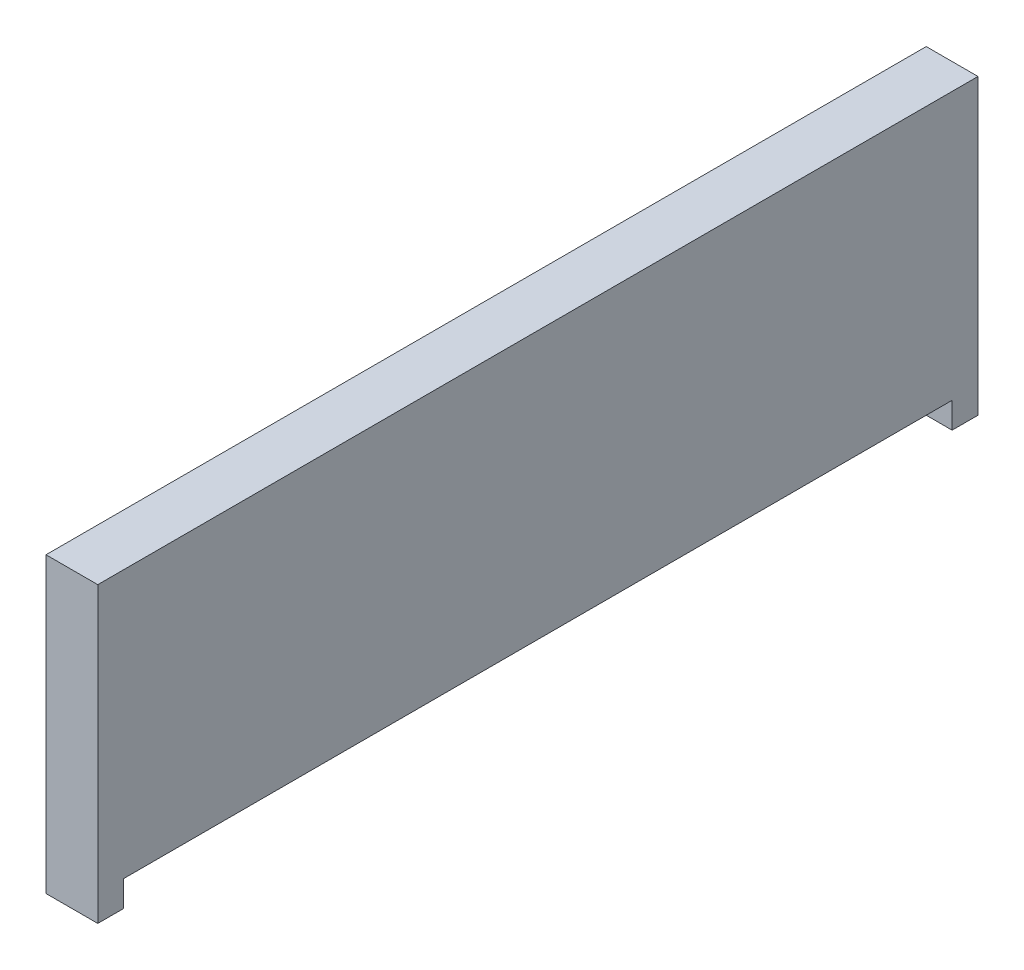
ISO-10303-21;
HEADER;
FILE_DESCRIPTION(('STEP AP214'),'2;1');
FILE_NAME('part.step','',(''),(''),'','','');
FILE_SCHEMA(('AUTOMOTIVE_DESIGN { 1 0 10303 214 1 1 1 1 }'));
ENDSEC;
DATA;
#1=APPLICATION_CONTEXT('core data for automotive mechanical design processes');
#2=APPLICATION_PROTOCOL_DEFINITION('international standard','automotive_design',2000,#1);
#3=PRODUCT_CONTEXT('',#1,'mechanical');
#4=PRODUCT('Part','Part','',(#3));
#5=PRODUCT_RELATED_PRODUCT_CATEGORY('part','',(#4));
#6=PRODUCT_DEFINITION_FORMATION('','',#4);
#7=PRODUCT_DEFINITION_CONTEXT('part definition',#1,'design');
#8=PRODUCT_DEFINITION('design','',#6,#7);
#9=PRODUCT_DEFINITION_SHAPE('','',#8);
#10=(LENGTH_UNIT() NAMED_UNIT(*) SI_UNIT(.MILLI.,.METRE.));
#11=(NAMED_UNIT(*) PLANE_ANGLE_UNIT() SI_UNIT($,.RADIAN.));
#12=(NAMED_UNIT(*) SI_UNIT($,.STERADIAN.) SOLID_ANGLE_UNIT());
#13=UNCERTAINTY_MEASURE_WITH_UNIT(LENGTH_MEASURE(1.E-05),#10,'distance_accuracy_value','');
#14=(GEOMETRIC_REPRESENTATION_CONTEXT(3) GLOBAL_UNCERTAINTY_ASSIGNED_CONTEXT((#13)) GLOBAL_UNIT_ASSIGNED_CONTEXT((#10,
#11,#12)) REPRESENTATION_CONTEXT('',''));
#15=CARTESIAN_POINT('',(0.,0.,0.));
#16=DIRECTION('',(0.,0.,1.));
#17=DIRECTION('',(1.,0.,0.));
#18=AXIS2_PLACEMENT_3D('',#15,#16,#17);
#19=CARTESIAN_POINT('',(15.,0.,510.));
#20=DIRECTION('',(-1.,0.,0.));
#21=DIRECTION('',(0.,0.,1.));
#22=AXIS2_PLACEMENT_3D('',#19,#20,#21);
#23=PLANE('',#22);
#24=DIRECTION('',(0.,0.,-1.));
#25=VECTOR('',#24,1.);
#26=CARTESIAN_POINT('',(15.,15.,510.));
#27=LINE('',#26,#25);
#28=CARTESIAN_POINT('',(15.,15.,495.));
#29=VERTEX_POINT('',#28);
#30=CARTESIAN_POINT('',(15.,15.,15.));
#31=VERTEX_POINT('',#30);
#32=EDGE_CURVE('E57',#29,#31,#27,.T.);
#33=ORIENTED_EDGE('',*,*,#32,.F.);
#34=DIRECTION('',(0.,1.,0.));
#35=VECTOR('',#34,1.);
#36=CARTESIAN_POINT('',(15.,15.,495.));
#37=LINE('',#36,#35);
#38=CARTESIAN_POINT('',(15.,0.,495.));
#39=VERTEX_POINT('',#38);
#40=EDGE_CURVE('E132',#39,#29,#37,.T.);
#41=ORIENTED_EDGE('',*,*,#40,.F.);
#42=DIRECTION('',(0.,0.,-1.));
#43=VECTOR('',#42,1.);
#44=CARTESIAN_POINT('',(15.,0.,510.));
#45=LINE('',#44,#43);
#46=CARTESIAN_POINT('',(15.,0.,15.));
#47=VERTEX_POINT('',#46);
#48=EDGE_CURVE('E43',#39,#47,#45,.T.);
#49=ORIENTED_EDGE('',*,*,#48,.T.);
#50=DIRECTION('',(0.,1.,0.));
#51=VECTOR('',#50,1.);
#52=CARTESIAN_POINT('',(15.,15.,15.));
#53=LINE('',#52,#51);
#54=EDGE_CURVE('E138',#47,#31,#53,.T.);
#55=ORIENTED_EDGE('',*,*,#54,.T.);
#56=EDGE_LOOP('',(#33,#41,#49,#55));
#57=FACE_BOUND('',#56,.T.);
#58=ADVANCED_FACE('F35',(#57),#23,.F.);
#59=CARTESIAN_POINT('',(15.,15.,510.));
#60=DIRECTION('',(0.,1.,0.));
#61=DIRECTION('',(0.,0.,1.));
#62=AXIS2_PLACEMENT_3D('',#59,#60,#61);
#63=PLANE('',#62);
#64=DIRECTION('',(0.,0.,-1.));
#65=VECTOR('',#64,1.);
#66=CARTESIAN_POINT('',(30.,15.,510.));
#67=LINE('',#66,#65);
#68=CARTESIAN_POINT('',(30.,15.,495.));
#69=VERTEX_POINT('',#68);
#70=CARTESIAN_POINT('',(30.,15.,15.));
#71=VERTEX_POINT('',#70);
#72=EDGE_CURVE('E160',#69,#71,#67,.T.);
#73=ORIENTED_EDGE('',*,*,#72,.F.);
#74=DIRECTION('',(1.,0.,0.));
#75=VECTOR('',#74,1.);
#76=CARTESIAN_POINT('',(30.,15.,495.));
#77=LINE('',#76,#75);
#78=EDGE_CURVE('E126',#29,#69,#77,.T.);
#79=ORIENTED_EDGE('',*,*,#78,.F.);
#80=ORIENTED_EDGE('',*,*,#32,.T.);
#81=DIRECTION('',(1.,0.,0.));
#82=VECTOR('',#81,1.);
#83=CARTESIAN_POINT('',(30.,15.,15.));
#84=LINE('',#83,#82);
#85=EDGE_CURVE('E140',#31,#71,#84,.T.);
#86=ORIENTED_EDGE('',*,*,#85,.T.);
#87=EDGE_LOOP('',(#73,#79,#80,#86));
#88=FACE_BOUND('',#87,.T.);
#89=ADVANCED_FACE('F166',(#88),#63,.F.);
#90=CARTESIAN_POINT('',(0.,170.,510.));
#91=DIRECTION('',(1.,0.,0.));
#92=DIRECTION('',(0.,1.,0.));
#93=AXIS2_PLACEMENT_3D('',#90,#91,#92);
#94=PLANE('',#93);
#95=DIRECTION('',(0.,-1.,0.));
#96=VECTOR('',#95,1.);
#97=CARTESIAN_POINT('',(0.,170.,0.));
#98=LINE('',#97,#96);
#99=CARTESIAN_POINT('',(0.,170.,0.));
#100=VERTEX_POINT('',#99);
#101=CARTESIAN_POINT('',(0.,0.,0.));
#102=VERTEX_POINT('',#101);
#103=EDGE_CURVE('E145',#100,#102,#98,.T.);
#104=ORIENTED_EDGE('',*,*,#103,.T.);
#105=DIRECTION('',(0.,0.,-1.));
#106=VECTOR('',#105,1.);
#107=CARTESIAN_POINT('',(0.,0.,510.));
#108=LINE('',#107,#106);
#109=CARTESIAN_POINT('',(0.,0.,510.));
#110=VERTEX_POINT('',#109);
#111=EDGE_CURVE('E11',#110,#102,#108,.T.);
#112=ORIENTED_EDGE('',*,*,#111,.F.);
#113=DIRECTION('',(0.,-1.,0.));
#114=VECTOR('',#113,1.);
#115=CARTESIAN_POINT('',(0.,170.,510.));
#116=LINE('',#115,#114);
#117=CARTESIAN_POINT('',(0.,170.,510.));
#118=VERTEX_POINT('',#117);
#119=EDGE_CURVE('E117',#118,#110,#116,.T.);
#120=ORIENTED_EDGE('',*,*,#119,.F.);
#121=DIRECTION('',(0.,0.,-1.));
#122=VECTOR('',#121,1.);
#123=CARTESIAN_POINT('',(0.,170.,510.));
#124=LINE('',#123,#122);
#125=EDGE_CURVE('E149',#118,#100,#124,.T.);
#126=ORIENTED_EDGE('',*,*,#125,.T.);
#127=EDGE_LOOP('',(#104,#112,#120,#126));
#128=FACE_BOUND('',#127,.T.);
#129=ADVANCED_FACE('F37',(#128),#94,.F.);
#130=CARTESIAN_POINT('',(0.,0.,510.));
#131=DIRECTION('',(0.,1.,0.));
#132=DIRECTION('',(0.,0.,1.));
#133=AXIS2_PLACEMENT_3D('',#130,#131,#132);
#134=PLANE('',#133);
#135=DIRECTION('',(1.,0.,0.));
#136=VECTOR('',#135,1.);
#137=CARTESIAN_POINT('',(0.,0.,0.));
#138=LINE('',#137,#136);
#139=CARTESIAN_POINT('',(30.,0.,0.));
#140=VERTEX_POINT('',#139);
#141=EDGE_CURVE('E152',#102,#140,#138,.T.);
#142=ORIENTED_EDGE('',*,*,#141,.T.);
#143=DIRECTION('',(0.,0.,-1.));
#144=VECTOR('',#143,1.);
#145=CARTESIAN_POINT('',(30.,0.,15.));
#146=LINE('',#145,#144);
#147=CARTESIAN_POINT('',(30.,0.,15.));
#148=VERTEX_POINT('',#147);
#149=EDGE_CURVE('E142',#148,#140,#146,.T.);
#150=ORIENTED_EDGE('',*,*,#149,.F.);
#151=DIRECTION('',(-1.,0.,0.));
#152=VECTOR('',#151,1.);
#153=CARTESIAN_POINT('',(30.,0.,15.));
#154=LINE('',#153,#152);
#155=EDGE_CURVE('E129',#148,#47,#154,.T.);
#156=ORIENTED_EDGE('',*,*,#155,.T.);
#157=ORIENTED_EDGE('',*,*,#48,.F.);
#158=DIRECTION('',(-1.,0.,0.));
#159=VECTOR('',#158,1.);
#160=CARTESIAN_POINT('',(30.,0.,495.));
#161=LINE('',#160,#159);
#162=CARTESIAN_POINT('',(30.,0.,495.));
#163=VERTEX_POINT('',#162);
#164=EDGE_CURVE('E123',#163,#39,#161,.T.);
#165=ORIENTED_EDGE('',*,*,#164,.F.);
#166=DIRECTION('',(0.,0.,-1.));
#167=VECTOR('',#166,1.);
#168=CARTESIAN_POINT('',(30.,0.,510.));
#169=LINE('',#168,#167);
#170=CARTESIAN_POINT('',(30.,0.,510.));
#171=VERTEX_POINT('',#170);
#172=EDGE_CURVE('E105',#171,#163,#169,.T.);
#173=ORIENTED_EDGE('',*,*,#172,.F.);
#174=DIRECTION('',(1.,0.,0.));
#175=VECTOR('',#174,1.);
#176=CARTESIAN_POINT('',(0.,0.,510.));
#177=LINE('',#176,#175);
#178=EDGE_CURVE('E112',#110,#171,#177,.T.);
#179=ORIENTED_EDGE('',*,*,#178,.F.);
#180=ORIENTED_EDGE('',*,*,#111,.T.);
#181=EDGE_LOOP('',(#142,#150,#156,#157,#165,#173,#179,#180));
#182=FACE_BOUND('',#181,.T.);
#183=ADVANCED_FACE('F122',(#182),#134,.F.);
#184=CARTESIAN_POINT('',(30.,15.,510.));
#185=DIRECTION('',(-1.,0.,0.));
#186=DIRECTION('',(0.,-1.,0.));
#187=AXIS2_PLACEMENT_3D('',#184,#185,#186);
#188=PLANE('',#187);
#189=DIRECTION('',(0.,1.,0.));
#190=VECTOR('',#189,1.);
#191=CARTESIAN_POINT('',(30.,15.,0.));
#192=LINE('',#191,#190);
#193=CARTESIAN_POINT('',(30.,170.,0.));
#194=VERTEX_POINT('',#193);
#195=EDGE_CURVE('E154',#140,#194,#192,.T.);
#196=ORIENTED_EDGE('',*,*,#195,.T.);
#197=DIRECTION('',(0.,0.,-1.));
#198=VECTOR('',#197,1.);
#199=CARTESIAN_POINT('',(30.,170.,510.));
#200=LINE('',#199,#198);
#201=CARTESIAN_POINT('',(30.,170.,510.));
#202=VERTEX_POINT('',#201);
#203=EDGE_CURVE('E108',#202,#194,#200,.T.);
#204=ORIENTED_EDGE('',*,*,#203,.F.);
#205=DIRECTION('',(0.,1.,0.));
#206=VECTOR('',#205,1.);
#207=CARTESIAN_POINT('',(30.,15.,510.));
#208=LINE('',#207,#206);
#209=EDGE_CURVE('E101',#171,#202,#208,.T.);
#210=ORIENTED_EDGE('',*,*,#209,.F.);
#211=ORIENTED_EDGE('',*,*,#172,.T.);
#212=DIRECTION('',(0.,-1.,0.));
#213=VECTOR('',#212,1.);
#214=CARTESIAN_POINT('',(30.,15.,495.));
#215=LINE('',#214,#213);
#216=EDGE_CURVE('E164',#69,#163,#215,.T.);
#217=ORIENTED_EDGE('',*,*,#216,.F.);
#218=ORIENTED_EDGE('',*,*,#72,.T.);
#219=DIRECTION('',(0.,-1.,0.));
#220=VECTOR('',#219,1.);
#221=CARTESIAN_POINT('',(30.,15.,15.));
#222=LINE('',#221,#220);
#223=EDGE_CURVE('E125',#71,#148,#222,.T.);
#224=ORIENTED_EDGE('',*,*,#223,.T.);
#225=ORIENTED_EDGE('',*,*,#149,.T.);
#226=EDGE_LOOP('',(#196,#204,#210,#211,#217,#218,#224,#225));
#227=FACE_BOUND('',#226,.T.);
#228=ADVANCED_FACE('F103',(#227),#188,.F.);
#229=CARTESIAN_POINT('',(30.,170.,510.));
#230=DIRECTION('',(0.,-1.,0.));
#231=DIRECTION('',(0.,0.,-1.));
#232=AXIS2_PLACEMENT_3D('',#229,#230,#231);
#233=PLANE('',#232);
#234=DIRECTION('',(-1.,0.,0.));
#235=VECTOR('',#234,1.);
#236=CARTESIAN_POINT('',(30.,170.,0.));
#237=LINE('',#236,#235);
#238=EDGE_CURVE('E146',#194,#100,#237,.T.);
#239=ORIENTED_EDGE('',*,*,#238,.T.);
#240=ORIENTED_EDGE('',*,*,#125,.F.);
#241=DIRECTION('',(-1.,0.,0.));
#242=VECTOR('',#241,1.);
#243=CARTESIAN_POINT('',(30.,170.,510.));
#244=LINE('',#243,#242);
#245=EDGE_CURVE('E111',#202,#118,#244,.T.);
#246=ORIENTED_EDGE('',*,*,#245,.F.);
#247=ORIENTED_EDGE('',*,*,#203,.T.);
#248=EDGE_LOOP('',(#239,#240,#246,#247));
#249=FACE_BOUND('',#248,.T.);
#250=ADVANCED_FACE('F173',(#249),#233,.F.);
#251=CARTESIAN_POINT('',(0.,0.,510.));
#252=DIRECTION('',(0.,0.,1.));
#253=DIRECTION('',(1.,0.,0.));
#254=AXIS2_PLACEMENT_3D('',#251,#252,#253);
#255=PLANE('',#254);
#256=ORIENTED_EDGE('',*,*,#178,.T.);
#257=ORIENTED_EDGE('',*,*,#209,.T.);
#258=ORIENTED_EDGE('',*,*,#245,.T.);
#259=ORIENTED_EDGE('',*,*,#119,.T.);
#260=EDGE_LOOP('',(#256,#257,#258,#259));
#261=FACE_BOUND('',#260,.T.);
#262=ADVANCED_FACE('F115',(#261),#255,.T.);
#263=CARTESIAN_POINT('',(0.,0.,0.));
#264=DIRECTION('',(0.,0.,1.));
#265=DIRECTION('',(1.,0.,0.));
#266=AXIS2_PLACEMENT_3D('',#263,#264,#265);
#267=PLANE('',#266);
#268=ORIENTED_EDGE('',*,*,#195,.F.);
#269=ORIENTED_EDGE('',*,*,#141,.F.);
#270=ORIENTED_EDGE('',*,*,#103,.F.);
#271=ORIENTED_EDGE('',*,*,#238,.F.);
#272=EDGE_LOOP('',(#268,#269,#270,#271));
#273=FACE_BOUND('',#272,.T.);
#274=ADVANCED_FACE('F176',(#273),#267,.F.);
#275=CARTESIAN_POINT('',(0.,0.,15.));
#276=DIRECTION('',(0.,0.,-1.));
#277=DIRECTION('',(-1.,0.,0.));
#278=AXIS2_PLACEMENT_3D('',#275,#276,#277);
#279=PLANE('',#278);
#280=ORIENTED_EDGE('',*,*,#223,.F.);
#281=ORIENTED_EDGE('',*,*,#85,.F.);
#282=ORIENTED_EDGE('',*,*,#54,.F.);
#283=ORIENTED_EDGE('',*,*,#155,.F.);
#284=EDGE_LOOP('',(#280,#281,#282,#283));
#285=FACE_BOUND('',#284,.T.);
#286=ADVANCED_FACE('F169',(#285),#279,.F.);
#287=CARTESIAN_POINT('',(0.,0.,495.));
#288=DIRECTION('',(0.,0.,-1.));
#289=DIRECTION('',(-1.,0.,0.));
#290=AXIS2_PLACEMENT_3D('',#287,#288,#289);
#291=PLANE('',#290);
#292=ORIENTED_EDGE('',*,*,#216,.T.);
#293=ORIENTED_EDGE('',*,*,#164,.T.);
#294=ORIENTED_EDGE('',*,*,#40,.T.);
#295=ORIENTED_EDGE('',*,*,#78,.T.);
#296=EDGE_LOOP('',(#292,#293,#294,#295));
#297=FACE_BOUND('',#296,.T.);
#298=ADVANCED_FACE('F200',(#297),#291,.T.);
#299=CLOSED_SHELL('',(#58,#89,#129,#183,#228,#250,#262,#274,#286,#298));
#300=MANIFOLD_SOLID_BREP('B2',#299);
#301=ADVANCED_BREP_SHAPE_REPRESENTATION('',(#18,#300),#14);
#302=SHAPE_DEFINITION_REPRESENTATION(#9,#301);
ENDSEC;
END-ISO-10303-21;
